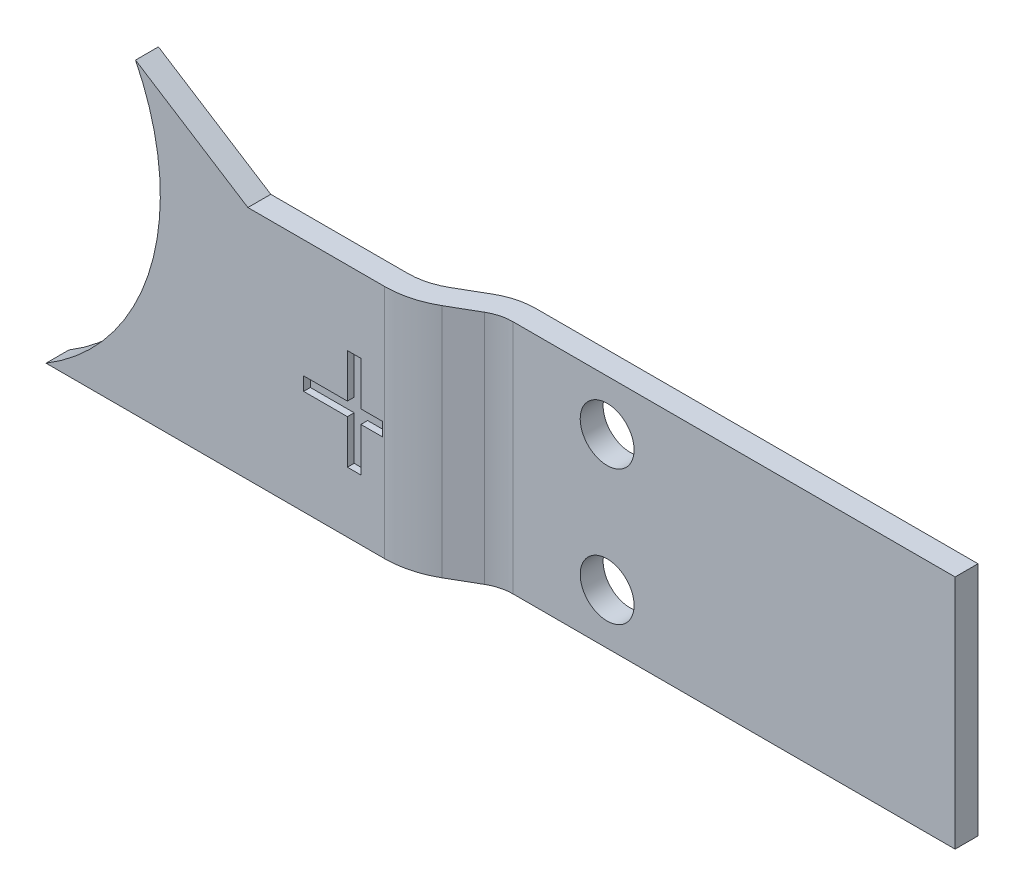
ISO-10303-21;
HEADER;
FILE_DESCRIPTION(('STEP AP214'),'2;1');
FILE_NAME('part.step','',(''),(''),'','','');
FILE_SCHEMA(('AUTOMOTIVE_DESIGN { 1 0 10303 214 1 1 1 1 }'));
ENDSEC;
DATA;
#1=APPLICATION_CONTEXT('core data for automotive mechanical design processes');
#2=APPLICATION_PROTOCOL_DEFINITION('international standard','automotive_design',2000,#1);
#3=PRODUCT_CONTEXT('',#1,'mechanical');
#4=PRODUCT('Part','Part','',(#3));
#5=PRODUCT_RELATED_PRODUCT_CATEGORY('part','',(#4));
#6=PRODUCT_DEFINITION_FORMATION('','',#4);
#7=PRODUCT_DEFINITION_CONTEXT('part definition',#1,'design');
#8=PRODUCT_DEFINITION('design','',#6,#7);
#9=PRODUCT_DEFINITION_SHAPE('','',#8);
#10=(LENGTH_UNIT() NAMED_UNIT(*) SI_UNIT(.MILLI.,.METRE.));
#11=(NAMED_UNIT(*) PLANE_ANGLE_UNIT() SI_UNIT($,.RADIAN.));
#12=(NAMED_UNIT(*) SI_UNIT($,.STERADIAN.) SOLID_ANGLE_UNIT());
#13=UNCERTAINTY_MEASURE_WITH_UNIT(LENGTH_MEASURE(1.E-05),#10,'distance_accuracy_value','');
#14=(GEOMETRIC_REPRESENTATION_CONTEXT(3) GLOBAL_UNCERTAINTY_ASSIGNED_CONTEXT((#13)) GLOBAL_UNIT_ASSIGNED_CONTEXT((#10,
#11,#12)) REPRESENTATION_CONTEXT('',''));
#15=CARTESIAN_POINT('',(0.,0.,0.));
#16=DIRECTION('',(0.,0.,1.));
#17=DIRECTION('',(1.,0.,0.));
#18=AXIS2_PLACEMENT_3D('',#15,#16,#17);
#19=CARTESIAN_POINT('',(0.,0.,3.4));
#20=DIRECTION('',(0.,0.,1.));
#21=DIRECTION('',(1.,0.,0.));
#22=AXIS2_PLACEMENT_3D('',#19,#20,#21);
#23=PLANE('',#22);
#24=DIRECTION('',(0.,1.,0.));
#25=VECTOR('',#24,1.);
#26=CARTESIAN_POINT('',(68.3205080756887,-110.439791148411,3.4));
#27=LINE('',#26,#25);
#28=CARTESIAN_POINT('',(68.3205080756887,-30.,3.4));
#29=VERTEX_POINT('',#28);
#30=CARTESIAN_POINT('',(68.3205080756887,5.,3.4));
#31=VERTEX_POINT('',#30);
#32=EDGE_CURVE('E220',#29,#31,#27,.T.);
#33=ORIENTED_EDGE('',*,*,#32,.T.);
#34=DIRECTION('',(-1.,0.,0.));
#35=VECTOR('',#34,1.);
#36=CARTESIAN_POINT('',(80.,5.,3.4));
#37=LINE('',#36,#35);
#38=CARTESIAN_POINT('',(48.,5.,3.4));
#39=VERTEX_POINT('',#38);
#40=EDGE_CURVE('E206',#31,#39,#37,.T.);
#41=ORIENTED_EDGE('',*,*,#40,.T.);
#42=DIRECTION('',(-0.843495742575284,0.537135860148408,0.));
#43=VECTOR('',#42,1.);
#44=CARTESIAN_POINT('',(48.,5.,3.4));
#45=LINE('',#44,#43);
#46=CARTESIAN_POINT('',(31.3204115569061,15.6215178489808,3.4));
#47=VERTEX_POINT('',#46);
#48=EDGE_CURVE('E216',#39,#47,#45,.T.);
#49=ORIENTED_EDGE('',*,*,#48,.T.);
#50=CARTESIAN_POINT('',(0.,0.,3.4));
#51=DIRECTION('',(0.,0.,1.));
#52=DIRECTION('',(1.,0.,0.));
#53=AXIS2_PLACEMENT_3D('',#50,#51,#52);
#54=CIRCLE('',#53,35.);
#55=CARTESIAN_POINT('',(18.02775637732,-30.,3.4));
#56=VERTEX_POINT('',#55);
#57=EDGE_CURVE('E61',#56,#47,#54,.T.);
#58=ORIENTED_EDGE('',*,*,#57,.F.);
#59=DIRECTION('',(1.,0.,0.));
#60=VECTOR('',#59,1.);
#61=CARTESIAN_POINT('',(0.,-30.,3.4));
#62=LINE('',#61,#60);
#63=EDGE_CURVE('E217',#56,#29,#62,.T.);
#64=ORIENTED_EDGE('',*,*,#63,.T.);
#65=EDGE_LOOP('',(#33,#41,#49,#58,#64));
#66=FACE_BOUND('',#65,.T.);
#67=DIRECTION('',(-1.,0.,0.));
#68=VECTOR('',#67,1.);
#69=CARTESIAN_POINT('',(0.,-12.5,3.4));
#70=LINE('',#69,#68);
#71=CARTESIAN_POINT('',(68.,-12.5,3.4));
#72=VERTEX_POINT('',#71);
#73=CARTESIAN_POINT('',(64.7753826404039,-12.5,3.4));
#74=VERTEX_POINT('',#73);
#75=EDGE_CURVE('E323',#72,#74,#70,.T.);
#76=ORIENTED_EDGE('',*,*,#75,.F.);
#77=DIRECTION('',(0.,1.,0.));
#78=VECTOR('',#77,1.);
#79=CARTESIAN_POINT('',(68.,-110.439791148411,3.4));
#80=LINE('',#79,#78);
#81=CARTESIAN_POINT('',(68.,-14.5,3.4));
#82=VERTEX_POINT('',#81);
#83=EDGE_CURVE('E226',#82,#72,#80,.T.);
#84=ORIENTED_EDGE('',*,*,#83,.F.);
#85=DIRECTION('',(-1.,0.,0.));
#86=VECTOR('',#85,1.);
#87=CARTESIAN_POINT('',(0.,-14.5,3.4));
#88=LINE('',#87,#86);
#89=CARTESIAN_POINT('',(64.7753826404039,-14.5,3.4));
#90=VERTEX_POINT('',#89);
#91=EDGE_CURVE('E53',#82,#90,#88,.T.);
#92=ORIENTED_EDGE('',*,*,#91,.T.);
#93=DIRECTION('',(0.,-1.,0.));
#94=VECTOR('',#93,1.);
#95=CARTESIAN_POINT('',(64.7753826404039,0.,3.4));
#96=LINE('',#95,#94);
#97=CARTESIAN_POINT('',(64.7753826404039,-21.,3.4));
#98=VERTEX_POINT('',#97);
#99=EDGE_CURVE('E289',#90,#98,#96,.T.);
#100=ORIENTED_EDGE('',*,*,#99,.T.);
#101=DIRECTION('',(-1.,0.,0.));
#102=VECTOR('',#101,1.);
#103=CARTESIAN_POINT('',(0.,-21.,3.4));
#104=LINE('',#103,#102);
#105=CARTESIAN_POINT('',(62.7753826404039,-21.,3.4));
#106=VERTEX_POINT('',#105);
#107=EDGE_CURVE('E294',#98,#106,#104,.T.);
#108=ORIENTED_EDGE('',*,*,#107,.T.);
#109=DIRECTION('',(0.,-1.,0.));
#110=VECTOR('',#109,1.);
#111=CARTESIAN_POINT('',(62.7753826404039,0.,3.4));
#112=LINE('',#111,#110);
#113=CARTESIAN_POINT('',(62.7753826404039,-14.5,3.4));
#114=VERTEX_POINT('',#113);
#115=EDGE_CURVE('E343',#114,#106,#112,.T.);
#116=ORIENTED_EDGE('',*,*,#115,.F.);
#117=DIRECTION('',(-1.,0.,0.));
#118=VECTOR('',#117,1.);
#119=CARTESIAN_POINT('',(0.,-14.5,3.4));
#120=LINE('',#119,#118);
#121=CARTESIAN_POINT('',(56.2753826404039,-14.5,3.4));
#122=VERTEX_POINT('',#121);
#123=EDGE_CURVE('E340',#114,#122,#120,.T.);
#124=ORIENTED_EDGE('',*,*,#123,.T.);
#125=DIRECTION('',(0.,-1.,0.));
#126=VECTOR('',#125,1.);
#127=CARTESIAN_POINT('',(56.2753826404039,0.,3.4));
#128=LINE('',#127,#126);
#129=CARTESIAN_POINT('',(56.2753826404039,-12.5,3.4));
#130=VERTEX_POINT('',#129);
#131=EDGE_CURVE('E337',#130,#122,#128,.T.);
#132=ORIENTED_EDGE('',*,*,#131,.F.);
#133=DIRECTION('',(-1.,0.,0.));
#134=VECTOR('',#133,1.);
#135=CARTESIAN_POINT('',(0.,-12.5,3.4));
#136=LINE('',#135,#134);
#137=CARTESIAN_POINT('',(62.7753826404039,-12.5,3.4));
#138=VERTEX_POINT('',#137);
#139=EDGE_CURVE('E334',#138,#130,#136,.T.);
#140=ORIENTED_EDGE('',*,*,#139,.F.);
#141=DIRECTION('',(0.,-1.,0.));
#142=VECTOR('',#141,1.);
#143=CARTESIAN_POINT('',(62.7753826404039,0.,3.4));
#144=LINE('',#143,#142);
#145=CARTESIAN_POINT('',(62.7753826404039,-6.00000000000001,3.4));
#146=VERTEX_POINT('',#145);
#147=EDGE_CURVE('E331',#146,#138,#144,.T.);
#148=ORIENTED_EDGE('',*,*,#147,.F.);
#149=DIRECTION('',(-1.,0.,0.));
#150=VECTOR('',#149,1.);
#151=CARTESIAN_POINT('',(0.,-6.00000000000001,3.4));
#152=LINE('',#151,#150);
#153=CARTESIAN_POINT('',(64.7753826404039,-6.00000000000001,3.4));
#154=VERTEX_POINT('',#153);
#155=EDGE_CURVE('E328',#154,#146,#152,.T.);
#156=ORIENTED_EDGE('',*,*,#155,.F.);
#157=DIRECTION('',(0.,-1.,0.));
#158=VECTOR('',#157,1.);
#159=CARTESIAN_POINT('',(64.7753826404039,0.,3.4));
#160=LINE('',#159,#158);
#161=EDGE_CURVE('E325',#154,#74,#160,.T.);
#162=ORIENTED_EDGE('',*,*,#161,.T.);
#163=EDGE_LOOP('',(#76,#84,#92,#100,#108,#116,#124,#132,#140,#148,#156,#162));
#164=FACE_BOUND('',#163,.T.);
#165=ADVANCED_FACE('F36',(#66,#164),#23,.T.);
#166=CARTESIAN_POINT('',(0.,0.,0.));
#167=DIRECTION('',(0.,0.,1.));
#168=DIRECTION('',(1.,0.,0.));
#169=AXIS2_PLACEMENT_3D('',#166,#167,#168);
#170=PLANE('',#169);
#171=DIRECTION('',(-1.,0.,0.));
#172=VECTOR('',#171,1.);
#173=CARTESIAN_POINT('',(80.,5.,0.));
#174=LINE('',#173,#172);
#175=CARTESIAN_POINT('',(68.3205080756887,5.,0.));
#176=VERTEX_POINT('',#175);
#177=CARTESIAN_POINT('',(48.,5.,0.));
#178=VERTEX_POINT('',#177);
#179=EDGE_CURVE('E381',#176,#178,#174,.T.);
#180=ORIENTED_EDGE('',*,*,#179,.F.);
#181=DIRECTION('',(0.,1.,0.));
#182=VECTOR('',#181,1.);
#183=CARTESIAN_POINT('',(68.3205080756887,-110.439791148411,0.));
#184=LINE('',#183,#182);
#185=CARTESIAN_POINT('',(68.3205080756887,-30.,0.));
#186=VERTEX_POINT('',#185);
#187=EDGE_CURVE('E261',#186,#176,#184,.T.);
#188=ORIENTED_EDGE('',*,*,#187,.F.);
#189=DIRECTION('',(1.,0.,0.));
#190=VECTOR('',#189,1.);
#191=CARTESIAN_POINT('',(0.,-30.,0.));
#192=LINE('',#191,#190);
#193=CARTESIAN_POINT('',(18.02775637732,-30.,0.));
#194=VERTEX_POINT('',#193);
#195=EDGE_CURVE('E376',#194,#186,#192,.T.);
#196=ORIENTED_EDGE('',*,*,#195,.F.);
#197=CARTESIAN_POINT('',(0.,0.,0.));
#198=DIRECTION('',(0.,0.,-1.));
#199=DIRECTION('',(-1.,0.,0.));
#200=AXIS2_PLACEMENT_3D('',#197,#198,#199);
#201=CIRCLE('',#200,35.);
#202=CARTESIAN_POINT('',(31.3204115569061,15.6215178489808,0.));
#203=VERTEX_POINT('',#202);
#204=EDGE_CURVE('E351',#203,#194,#201,.T.);
#205=ORIENTED_EDGE('',*,*,#204,.F.);
#206=DIRECTION('',(-0.843495742575284,0.537135860148408,0.));
#207=VECTOR('',#206,1.);
#208=CARTESIAN_POINT('',(48.,5.,0.));
#209=LINE('',#208,#207);
#210=EDGE_CURVE('E377',#178,#203,#209,.T.);
#211=ORIENTED_EDGE('',*,*,#210,.F.);
#212=EDGE_LOOP('',(#180,#188,#196,#205,#211));
#213=FACE_BOUND('',#212,.T.);
#214=ADVANCED_FACE('F461',(#213),#170,.F.);
#215=CARTESIAN_POINT('',(0.,-30.,3.4));
#216=DIRECTION('',(0.,1.,0.));
#217=DIRECTION('',(-1.,0.,0.));
#218=AXIS2_PLACEMENT_3D('',#215,#216,#217);
#219=PLANE('',#218);
#220=ORIENTED_EDGE('',*,*,#195,.T.);
#221=CARTESIAN_POINT('',(68.3205080756888,-30.,-10.));
#222=DIRECTION('',(0.,1.,0.));
#223=DIRECTION('',(-1.,0.,0.));
#224=AXIS2_PLACEMENT_3D('',#221,#222,#223);
#225=CIRCLE('',#224,10.);
#226=CARTESIAN_POINT('',(73.3205080756888,-30.,-1.33974596215563));
#227=VERTEX_POINT('',#226);
#228=EDGE_CURVE('E238',#186,#227,#225,.T.);
#229=ORIENTED_EDGE('',*,*,#228,.T.);
#230=DIRECTION('',(0.866025403784437,0.,-0.500000000000002));
#231=VECTOR('',#230,1.);
#232=CARTESIAN_POINT('',(73.3205080756888,-30.,-1.33974596215564));
#233=LINE('',#232,#231);
#234=CARTESIAN_POINT('',(77.3397459621556,-30.,-3.66025403784437));
#235=VERTEX_POINT('',#234);
#236=EDGE_CURVE('E409',#227,#235,#233,.T.);
#237=ORIENTED_EDGE('',*,*,#236,.T.);
#238=CARTESIAN_POINT('',(82.3397459621556,-30.,5.));
#239=DIRECTION('',(0.,1.,0.));
#240=DIRECTION('',(-1.,0.,0.));
#241=AXIS2_PLACEMENT_3D('',#238,#239,#240);
#242=CIRCLE('',#241,10.);
#243=CARTESIAN_POINT('',(82.3397459621556,-30.,-5.));
#244=VERTEX_POINT('',#243);
#245=EDGE_CURVE('E408',#235,#244,#242,.F.);
#246=ORIENTED_EDGE('',*,*,#245,.T.);
#247=DIRECTION('',(1.,0.,0.));
#248=VECTOR('',#247,1.);
#249=CARTESIAN_POINT('',(82.3397459621556,-30.,-5.));
#250=LINE('',#249,#248);
#251=CARTESIAN_POINT('',(148.,-30.,-5.));
#252=VERTEX_POINT('',#251);
#253=EDGE_CURVE('E406',#244,#252,#250,.T.);
#254=ORIENTED_EDGE('',*,*,#253,.T.);
#255=DIRECTION('',(0.,0.,1.));
#256=VECTOR('',#255,1.);
#257=CARTESIAN_POINT('',(148.,-30.,-1.6));
#258=LINE('',#257,#256);
#259=CARTESIAN_POINT('',(148.,-30.,-1.6));
#260=VERTEX_POINT('',#259);
#261=EDGE_CURVE('E404',#252,#260,#258,.T.);
#262=ORIENTED_EDGE('',*,*,#261,.T.);
#263=DIRECTION('',(-1.,0.,0.));
#264=VECTOR('',#263,1.);
#265=CARTESIAN_POINT('',(83.,-30.,-1.6));
#266=LINE('',#265,#264);
#267=CARTESIAN_POINT('',(82.3397459621556,-30.,-1.59999999999999));
#268=VERTEX_POINT('',#267);
#269=EDGE_CURVE('E402',#260,#268,#266,.T.);
#270=ORIENTED_EDGE('',*,*,#269,.T.);
#271=CARTESIAN_POINT('',(82.3397459621556,-30.,5.));
#272=DIRECTION('',(0.,1.,0.));
#273=DIRECTION('',(-1.,0.,0.));
#274=AXIS2_PLACEMENT_3D('',#271,#272,#273);
#275=CIRCLE('',#274,6.59999999999999);
#276=CARTESIAN_POINT('',(79.0397459621556,-30.,-0.715767664977264));
#277=VERTEX_POINT('',#276);
#278=EDGE_CURVE('E400',#268,#277,#275,.T.);
#279=ORIENTED_EDGE('',*,*,#278,.T.);
#280=DIRECTION('',(-0.866025403784439,0.,0.5));
#281=VECTOR('',#280,1.);
#282=CARTESIAN_POINT('',(75.0205080756889,-30.,1.60474041071144));
#283=LINE('',#282,#281);
#284=CARTESIAN_POINT('',(75.0205080756889,-30.,1.60474041071143));
#285=VERTEX_POINT('',#284);
#286=EDGE_CURVE('E398',#277,#285,#283,.T.);
#287=ORIENTED_EDGE('',*,*,#286,.T.);
#288=CARTESIAN_POINT('',(68.3205080756888,-30.,-10.));
#289=DIRECTION('',(0.,1.,0.));
#290=DIRECTION('',(-1.,0.,0.));
#291=AXIS2_PLACEMENT_3D('',#288,#289,#290);
#292=CIRCLE('',#291,13.4);
#293=EDGE_CURVE('E264',#285,#29,#292,.F.);
#294=ORIENTED_EDGE('',*,*,#293,.T.);
#295=ORIENTED_EDGE('',*,*,#63,.F.);
#296=DIRECTION('',(0.,0.,-1.));
#297=VECTOR('',#296,1.);
#298=CARTESIAN_POINT('',(18.02775637732,-30.,10.));
#299=LINE('',#298,#297);
#300=EDGE_CURVE('E373',#56,#194,#299,.T.);
#301=ORIENTED_EDGE('',*,*,#300,.T.);
#302=EDGE_LOOP('',(#220,#229,#237,#246,#254,#262,#270,#279,#287,#294,#295,#301));
#303=FACE_BOUND('',#302,.T.);
#304=ADVANCED_FACE('F38',(#303),#219,.F.);
#305=CARTESIAN_POINT('',(80.,5.,3.4));
#306=DIRECTION('',(0.,-1.,0.));
#307=DIRECTION('',(1.,0.,0.));
#308=AXIS2_PLACEMENT_3D('',#305,#306,#307);
#309=PLANE('',#308);
#310=ORIENTED_EDGE('',*,*,#40,.F.);
#311=CARTESIAN_POINT('',(68.3205080756888,5.,-10.));
#312=DIRECTION('',(0.,1.,0.));
#313=DIRECTION('',(-1.,0.,0.));
#314=AXIS2_PLACEMENT_3D('',#311,#312,#313);
#315=CIRCLE('',#314,13.4);
#316=CARTESIAN_POINT('',(75.0205080756888,5.,1.60474041071144));
#317=VERTEX_POINT('',#316);
#318=EDGE_CURVE('E211',#31,#317,#315,.T.);
#319=ORIENTED_EDGE('',*,*,#318,.T.);
#320=DIRECTION('',(0.866025403784439,0.,-0.5));
#321=VECTOR('',#320,1.);
#322=CARTESIAN_POINT('',(75.0205080756888,5.,1.60474041071144));
#323=LINE('',#322,#321);
#324=CARTESIAN_POINT('',(79.0397459621556,5.,-0.715767664977262));
#325=VERTEX_POINT('',#324);
#326=EDGE_CURVE('E231',#317,#325,#323,.T.);
#327=ORIENTED_EDGE('',*,*,#326,.T.);
#328=CARTESIAN_POINT('',(82.3397459621556,5.,5.));
#329=DIRECTION('',(0.,-1.,0.));
#330=DIRECTION('',(1.,0.,0.));
#331=AXIS2_PLACEMENT_3D('',#328,#329,#330);
#332=CIRCLE('',#331,6.59999999999999);
#333=CARTESIAN_POINT('',(82.3397459621556,5.,-1.6));
#334=VERTEX_POINT('',#333);
#335=EDGE_CURVE('E233',#325,#334,#332,.T.);
#336=ORIENTED_EDGE('',*,*,#335,.T.);
#337=DIRECTION('',(1.,0.,0.));
#338=VECTOR('',#337,1.);
#339=CARTESIAN_POINT('',(83.,5.,-1.6));
#340=LINE('',#339,#338);
#341=CARTESIAN_POINT('',(148.,5.00000000000001,-1.6));
#342=VERTEX_POINT('',#341);
#343=EDGE_CURVE('E243',#334,#342,#340,.T.);
#344=ORIENTED_EDGE('',*,*,#343,.T.);
#345=DIRECTION('',(0.,0.,-1.));
#346=VECTOR('',#345,1.);
#347=CARTESIAN_POINT('',(148.,5.00000000000001,-1.6));
#348=LINE('',#347,#346);
#349=CARTESIAN_POINT('',(148.,5.00000000000001,-5.));
#350=VERTEX_POINT('',#349);
#351=EDGE_CURVE('E246',#342,#350,#348,.T.);
#352=ORIENTED_EDGE('',*,*,#351,.T.);
#353=DIRECTION('',(-1.,0.,0.));
#354=VECTOR('',#353,1.);
#355=CARTESIAN_POINT('',(82.3397459621556,5.,-5.));
#356=LINE('',#355,#354);
#357=CARTESIAN_POINT('',(82.3397459621556,5.,-5.));
#358=VERTEX_POINT('',#357);
#359=EDGE_CURVE('E249',#350,#358,#356,.T.);
#360=ORIENTED_EDGE('',*,*,#359,.T.);
#361=CARTESIAN_POINT('',(82.3397459621556,5.,5.));
#362=DIRECTION('',(0.,1.,0.));
#363=DIRECTION('',(1.,0.,0.));
#364=AXIS2_PLACEMENT_3D('',#361,#362,#363);
#365=CIRCLE('',#364,10.);
#366=CARTESIAN_POINT('',(77.3397459621555,5.,-3.66025403784436));
#367=VERTEX_POINT('',#366);
#368=EDGE_CURVE('E252',#358,#367,#365,.T.);
#369=ORIENTED_EDGE('',*,*,#368,.T.);
#370=DIRECTION('',(-0.866025403784437,0.,0.500000000000002));
#371=VECTOR('',#370,1.);
#372=CARTESIAN_POINT('',(73.3205080756888,5.,-1.33974596215564));
#373=LINE('',#372,#371);
#374=CARTESIAN_POINT('',(73.3205080756888,5.,-1.33974596215564));
#375=VERTEX_POINT('',#374);
#376=EDGE_CURVE('E255',#367,#375,#373,.T.);
#377=ORIENTED_EDGE('',*,*,#376,.T.);
#378=CARTESIAN_POINT('',(68.3205080756888,5.,-10.));
#379=DIRECTION('',(0.,-1.,0.));
#380=DIRECTION('',(-1.,0.,0.));
#381=AXIS2_PLACEMENT_3D('',#378,#379,#380);
#382=CIRCLE('',#381,10.);
#383=EDGE_CURVE('E258',#375,#176,#382,.T.);
#384=ORIENTED_EDGE('',*,*,#383,.T.);
#385=ORIENTED_EDGE('',*,*,#179,.T.);
#386=DIRECTION('',(0.,0.,-1.));
#387=VECTOR('',#386,1.);
#388=CARTESIAN_POINT('',(48.,5.,3.4));
#389=LINE('',#388,#387);
#390=EDGE_CURVE('E45',#39,#178,#389,.T.);
#391=ORIENTED_EDGE('',*,*,#390,.F.);
#392=EDGE_LOOP('',(#310,#319,#327,#336,#344,#352,#360,#369,#377,#384,#385,#391));
#393=FACE_BOUND('',#392,.T.);
#394=ADVANCED_FACE('F208',(#393),#309,.F.);
#395=CARTESIAN_POINT('',(48.,5.,3.4));
#396=DIRECTION('',(-0.537135860148408,-0.843495742575284,0.));
#397=DIRECTION('',(0.843495742575284,-0.537135860148408,0.));
#398=AXIS2_PLACEMENT_3D('',#395,#396,#397);
#399=PLANE('',#398);
#400=ORIENTED_EDGE('',*,*,#210,.T.);
#401=DIRECTION('',(0.,0.,-1.));
#402=VECTOR('',#401,1.);
#403=CARTESIAN_POINT('',(31.3204115569061,15.6215178489808,10.));
#404=LINE('',#403,#402);
#405=EDGE_CURVE('E11',#203,#47,#404,.F.);
#406=ORIENTED_EDGE('',*,*,#405,.T.);
#407=ORIENTED_EDGE('',*,*,#48,.F.);
#408=ORIENTED_EDGE('',*,*,#390,.T.);
#409=EDGE_LOOP('',(#400,#406,#407,#408));
#410=FACE_BOUND('',#409,.T.);
#411=ADVANCED_FACE('F472',(#410),#399,.F.);
#412=CARTESIAN_POINT('',(0.,0.,10.));
#413=DIRECTION('',(0.,0.,-1.));
#414=DIRECTION('',(-1.,0.,0.));
#415=AXIS2_PLACEMENT_3D('',#412,#413,#414);
#416=CYLINDRICAL_SURFACE('',#415,35.);
#417=ORIENTED_EDGE('',*,*,#57,.T.);
#418=ORIENTED_EDGE('',*,*,#405,.F.);
#419=ORIENTED_EDGE('',*,*,#204,.T.);
#420=ORIENTED_EDGE('',*,*,#300,.F.);
#421=EDGE_LOOP('',(#417,#418,#419,#420));
#422=FACE_BOUND('',#421,.T.);
#423=ADVANCED_FACE('F469',(#422),#416,.F.);
#424=CARTESIAN_POINT('',(64.7753826404039,0.,2.4));
#425=DIRECTION('',(-1.,0.,0.));
#426=DIRECTION('',(0.,0.,1.));
#427=AXIS2_PLACEMENT_3D('',#424,#425,#426);
#428=PLANE('',#427);
#429=ORIENTED_EDGE('',*,*,#99,.F.);
#430=DIRECTION('',(0.,0.,1.));
#431=VECTOR('',#430,1.);
#432=CARTESIAN_POINT('',(64.7753826404039,-14.5,2.4));
#433=LINE('',#432,#431);
#434=CARTESIAN_POINT('',(64.7753826404039,-14.5,2.4));
#435=VERTEX_POINT('',#434);
#436=EDGE_CURVE('E320',#435,#90,#433,.T.);
#437=ORIENTED_EDGE('',*,*,#436,.F.);
#438=DIRECTION('',(0.,-1.,0.));
#439=VECTOR('',#438,1.);
#440=CARTESIAN_POINT('',(64.7753826404039,0.,2.4));
#441=LINE('',#440,#439);
#442=CARTESIAN_POINT('',(64.7753826404039,-21.,2.4));
#443=VERTEX_POINT('',#442);
#444=EDGE_CURVE('E290',#435,#443,#441,.T.);
#445=ORIENTED_EDGE('',*,*,#444,.T.);
#446=DIRECTION('',(0.,0.,1.));
#447=VECTOR('',#446,1.);
#448=CARTESIAN_POINT('',(64.7753826404039,-21.,2.4));
#449=LINE('',#448,#447);
#450=EDGE_CURVE('E348',#443,#98,#449,.T.);
#451=ORIENTED_EDGE('',*,*,#450,.T.);
#452=EDGE_LOOP('',(#429,#437,#445,#451));
#453=FACE_BOUND('',#452,.T.);
#454=ADVANCED_FACE('F575',(#453),#428,.T.);
#455=CARTESIAN_POINT('',(0.,-21.,2.4));
#456=DIRECTION('',(0.,1.,0.));
#457=DIRECTION('',(0.,0.,1.));
#458=AXIS2_PLACEMENT_3D('',#455,#456,#457);
#459=PLANE('',#458);
#460=ORIENTED_EDGE('',*,*,#107,.F.);
#461=ORIENTED_EDGE('',*,*,#450,.F.);
#462=DIRECTION('',(-1.,0.,0.));
#463=VECTOR('',#462,1.);
#464=CARTESIAN_POINT('',(0.,-21.,2.4));
#465=LINE('',#464,#463);
#466=CARTESIAN_POINT('',(62.7753826404039,-21.,2.4));
#467=VERTEX_POINT('',#466);
#468=EDGE_CURVE('E318',#443,#467,#465,.T.);
#469=ORIENTED_EDGE('',*,*,#468,.T.);
#470=DIRECTION('',(0.,0.,1.));
#471=VECTOR('',#470,1.);
#472=CARTESIAN_POINT('',(62.7753826404039,-21.,2.4));
#473=LINE('',#472,#471);
#474=EDGE_CURVE('E352',#467,#106,#473,.T.);
#475=ORIENTED_EDGE('',*,*,#474,.T.);
#476=EDGE_LOOP('',(#460,#461,#469,#475));
#477=FACE_BOUND('',#476,.T.);
#478=ADVANCED_FACE('F565',(#477),#459,.T.);
#479=CARTESIAN_POINT('',(62.7753826404039,0.,2.4));
#480=DIRECTION('',(-1.,0.,0.));
#481=DIRECTION('',(0.,0.,1.));
#482=AXIS2_PLACEMENT_3D('',#479,#480,#481);
#483=PLANE('',#482);
#484=ORIENTED_EDGE('',*,*,#115,.T.);
#485=ORIENTED_EDGE('',*,*,#474,.F.);
#486=DIRECTION('',(0.,-1.,0.));
#487=VECTOR('',#486,1.);
#488=CARTESIAN_POINT('',(62.7753826404039,0.,2.4));
#489=LINE('',#488,#487);
#490=CARTESIAN_POINT('',(62.7753826404039,-14.5,2.4));
#491=VERTEX_POINT('',#490);
#492=EDGE_CURVE('E315',#491,#467,#489,.T.);
#493=ORIENTED_EDGE('',*,*,#492,.F.);
#494=DIRECTION('',(0.,0.,1.));
#495=VECTOR('',#494,1.);
#496=CARTESIAN_POINT('',(62.7753826404039,-14.5,2.4));
#497=LINE('',#496,#495);
#498=EDGE_CURVE('E354',#491,#114,#497,.T.);
#499=ORIENTED_EDGE('',*,*,#498,.T.);
#500=EDGE_LOOP('',(#484,#485,#493,#499));
#501=FACE_BOUND('',#500,.T.);
#502=ADVANCED_FACE('F555',(#501),#483,.F.);
#503=CARTESIAN_POINT('',(0.,-14.5,2.4));
#504=DIRECTION('',(0.,1.,0.));
#505=DIRECTION('',(-1.,0.,0.));
#506=AXIS2_PLACEMENT_3D('',#503,#504,#505);
#507=PLANE('',#506);
#508=ORIENTED_EDGE('',*,*,#123,.F.);
#509=ORIENTED_EDGE('',*,*,#498,.F.);
#510=DIRECTION('',(-1.,0.,0.));
#511=VECTOR('',#510,1.);
#512=CARTESIAN_POINT('',(0.,-14.5,2.4));
#513=LINE('',#512,#511);
#514=CARTESIAN_POINT('',(56.2753826404039,-14.5,2.4));
#515=VERTEX_POINT('',#514);
#516=EDGE_CURVE('E313',#491,#515,#513,.T.);
#517=ORIENTED_EDGE('',*,*,#516,.T.);
#518=DIRECTION('',(0.,0.,1.));
#519=VECTOR('',#518,1.);
#520=CARTESIAN_POINT('',(56.2753826404039,-14.5,2.4));
#521=LINE('',#520,#519);
#522=EDGE_CURVE('E356',#515,#122,#521,.T.);
#523=ORIENTED_EDGE('',*,*,#522,.T.);
#524=EDGE_LOOP('',(#508,#509,#517,#523));
#525=FACE_BOUND('',#524,.T.);
#526=ADVANCED_FACE('F545',(#525),#507,.T.);
#527=CARTESIAN_POINT('',(56.2753826404039,0.,2.4));
#528=DIRECTION('',(-1.,0.,0.));
#529=DIRECTION('',(0.,0.,1.));
#530=AXIS2_PLACEMENT_3D('',#527,#528,#529);
#531=PLANE('',#530);
#532=ORIENTED_EDGE('',*,*,#131,.T.);
#533=ORIENTED_EDGE('',*,*,#522,.F.);
#534=DIRECTION('',(0.,-1.,0.));
#535=VECTOR('',#534,1.);
#536=CARTESIAN_POINT('',(56.2753826404039,0.,2.4));
#537=LINE('',#536,#535);
#538=CARTESIAN_POINT('',(56.2753826404039,-12.5,2.4));
#539=VERTEX_POINT('',#538);
#540=EDGE_CURVE('E310',#539,#515,#537,.T.);
#541=ORIENTED_EDGE('',*,*,#540,.F.);
#542=DIRECTION('',(0.,0.,1.));
#543=VECTOR('',#542,1.);
#544=CARTESIAN_POINT('',(56.2753826404039,-12.5,2.4));
#545=LINE('',#544,#543);
#546=EDGE_CURVE('E358',#539,#130,#545,.T.);
#547=ORIENTED_EDGE('',*,*,#546,.T.);
#548=EDGE_LOOP('',(#532,#533,#541,#547));
#549=FACE_BOUND('',#548,.T.);
#550=ADVANCED_FACE('F535',(#549),#531,.F.);
#551=CARTESIAN_POINT('',(0.,-12.5,2.4));
#552=DIRECTION('',(0.,1.,0.));
#553=DIRECTION('',(0.,0.,1.));
#554=AXIS2_PLACEMENT_3D('',#551,#552,#553);
#555=PLANE('',#554);
#556=ORIENTED_EDGE('',*,*,#139,.T.);
#557=ORIENTED_EDGE('',*,*,#546,.F.);
#558=DIRECTION('',(-1.,0.,0.));
#559=VECTOR('',#558,1.);
#560=CARTESIAN_POINT('',(0.,-12.5,2.4));
#561=LINE('',#560,#559);
#562=CARTESIAN_POINT('',(62.7753826404039,-12.5,2.4));
#563=VERTEX_POINT('',#562);
#564=EDGE_CURVE('E307',#563,#539,#561,.T.);
#565=ORIENTED_EDGE('',*,*,#564,.F.);
#566=DIRECTION('',(0.,0.,1.));
#567=VECTOR('',#566,1.);
#568=CARTESIAN_POINT('',(62.7753826404039,-12.5,2.4));
#569=LINE('',#568,#567);
#570=EDGE_CURVE('E360',#563,#138,#569,.T.);
#571=ORIENTED_EDGE('',*,*,#570,.T.);
#572=EDGE_LOOP('',(#556,#557,#565,#571));
#573=FACE_BOUND('',#572,.T.);
#574=ADVANCED_FACE('F525',(#573),#555,.F.);
#575=CARTESIAN_POINT('',(62.7753826404039,0.,2.4));
#576=DIRECTION('',(-1.,0.,0.));
#577=DIRECTION('',(0.,0.,1.));
#578=AXIS2_PLACEMENT_3D('',#575,#576,#577);
#579=PLANE('',#578);
#580=ORIENTED_EDGE('',*,*,#147,.T.);
#581=ORIENTED_EDGE('',*,*,#570,.F.);
#582=DIRECTION('',(0.,-1.,0.));
#583=VECTOR('',#582,1.);
#584=CARTESIAN_POINT('',(62.7753826404039,0.,2.4));
#585=LINE('',#584,#583);
#586=CARTESIAN_POINT('',(62.7753826404039,-6.00000000000001,2.4));
#587=VERTEX_POINT('',#586);
#588=EDGE_CURVE('E304',#587,#563,#585,.T.);
#589=ORIENTED_EDGE('',*,*,#588,.F.);
#590=DIRECTION('',(0.,0.,1.));
#591=VECTOR('',#590,1.);
#592=CARTESIAN_POINT('',(62.7753826404039,-6.00000000000001,2.4));
#593=LINE('',#592,#591);
#594=EDGE_CURVE('E362',#587,#146,#593,.T.);
#595=ORIENTED_EDGE('',*,*,#594,.T.);
#596=EDGE_LOOP('',(#580,#581,#589,#595));
#597=FACE_BOUND('',#596,.T.);
#598=ADVANCED_FACE('F515',(#597),#579,.F.);
#599=CARTESIAN_POINT('',(0.,-6.00000000000001,2.4));
#600=DIRECTION('',(0.,1.,0.));
#601=DIRECTION('',(0.,0.,1.));
#602=AXIS2_PLACEMENT_3D('',#599,#600,#601);
#603=PLANE('',#602);
#604=ORIENTED_EDGE('',*,*,#155,.T.);
#605=ORIENTED_EDGE('',*,*,#594,.F.);
#606=DIRECTION('',(-1.,0.,0.));
#607=VECTOR('',#606,1.);
#608=CARTESIAN_POINT('',(0.,-6.00000000000001,2.4));
#609=LINE('',#608,#607);
#610=CARTESIAN_POINT('',(64.7753826404039,-6.00000000000001,2.4));
#611=VERTEX_POINT('',#610);
#612=EDGE_CURVE('E301',#611,#587,#609,.T.);
#613=ORIENTED_EDGE('',*,*,#612,.F.);
#614=DIRECTION('',(0.,0.,1.));
#615=VECTOR('',#614,1.);
#616=CARTESIAN_POINT('',(64.7753826404039,-6.00000000000001,2.4));
#617=LINE('',#616,#615);
#618=EDGE_CURVE('E364',#611,#154,#617,.T.);
#619=ORIENTED_EDGE('',*,*,#618,.T.);
#620=EDGE_LOOP('',(#604,#605,#613,#619));
#621=FACE_BOUND('',#620,.T.);
#622=ADVANCED_FACE('F503',(#621),#603,.F.);
#623=CARTESIAN_POINT('',(64.7753826404039,0.,2.4));
#624=DIRECTION('',(-1.,0.,0.));
#625=DIRECTION('',(0.,0.,1.));
#626=AXIS2_PLACEMENT_3D('',#623,#624,#625);
#627=PLANE('',#626);
#628=ORIENTED_EDGE('',*,*,#161,.F.);
#629=ORIENTED_EDGE('',*,*,#618,.F.);
#630=DIRECTION('',(0.,-1.,0.));
#631=VECTOR('',#630,1.);
#632=CARTESIAN_POINT('',(64.7753826404039,0.,2.4));
#633=LINE('',#632,#631);
#634=CARTESIAN_POINT('',(64.7753826404039,-12.5,2.4));
#635=VERTEX_POINT('',#634);
#636=EDGE_CURVE('E298',#611,#635,#633,.T.);
#637=ORIENTED_EDGE('',*,*,#636,.T.);
#638=DIRECTION('',(0.,0.,1.));
#639=VECTOR('',#638,1.);
#640=CARTESIAN_POINT('',(64.7753826404039,-12.5,2.4));
#641=LINE('',#640,#639);
#642=EDGE_CURVE('E366',#635,#74,#641,.T.);
#643=ORIENTED_EDGE('',*,*,#642,.T.);
#644=EDGE_LOOP('',(#628,#629,#637,#643));
#645=FACE_BOUND('',#644,.T.);
#646=ADVANCED_FACE('F497',(#645),#627,.T.);
#647=CARTESIAN_POINT('',(0.,-12.5,2.4));
#648=DIRECTION('',(0.,1.,0.));
#649=DIRECTION('',(0.,0.,1.));
#650=AXIS2_PLACEMENT_3D('',#647,#648,#649);
#651=PLANE('',#650);
#652=DIRECTION('',(-1.,0.,0.));
#653=VECTOR('',#652,1.);
#654=CARTESIAN_POINT('',(0.,-12.5,2.4));
#655=LINE('',#654,#653);
#656=CARTESIAN_POINT('',(68.,-12.5,2.4));
#657=VERTEX_POINT('',#656);
#658=EDGE_CURVE('E296',#657,#635,#655,.T.);
#659=ORIENTED_EDGE('',*,*,#658,.F.);
#660=DIRECTION('',(0.,0.,-1.));
#661=VECTOR('',#660,1.);
#662=CARTESIAN_POINT('',(68.,-12.5,3.401));
#663=LINE('',#662,#661);
#664=EDGE_CURVE('E287',#72,#657,#663,.T.);
#665=ORIENTED_EDGE('',*,*,#664,.F.);
#666=ORIENTED_EDGE('',*,*,#75,.T.);
#667=ORIENTED_EDGE('',*,*,#642,.F.);
#668=EDGE_LOOP('',(#659,#665,#666,#667));
#669=FACE_BOUND('',#668,.T.);
#670=ADVANCED_FACE('F502',(#669),#651,.F.);
#671=CARTESIAN_POINT('',(0.,-14.5,2.4));
#672=DIRECTION('',(0.,1.,0.));
#673=DIRECTION('',(0.,0.,1.));
#674=AXIS2_PLACEMENT_3D('',#671,#672,#673);
#675=PLANE('',#674);
#676=DIRECTION('',(0.,0.,-1.));
#677=VECTOR('',#676,1.);
#678=CARTESIAN_POINT('',(68.,-14.5,3.401));
#679=LINE('',#678,#677);
#680=CARTESIAN_POINT('',(68.,-14.5,2.4));
#681=VERTEX_POINT('',#680);
#682=EDGE_CURVE('E284',#82,#681,#679,.T.);
#683=ORIENTED_EDGE('',*,*,#682,.T.);
#684=DIRECTION('',(-1.,0.,0.));
#685=VECTOR('',#684,1.);
#686=CARTESIAN_POINT('',(0.,-14.5,2.4));
#687=LINE('',#686,#685);
#688=EDGE_CURVE('E293',#681,#435,#687,.T.);
#689=ORIENTED_EDGE('',*,*,#688,.T.);
#690=ORIENTED_EDGE('',*,*,#436,.T.);
#691=ORIENTED_EDGE('',*,*,#91,.F.);
#692=EDGE_LOOP('',(#683,#689,#690,#691));
#693=FACE_BOUND('',#692,.T.);
#694=ADVANCED_FACE('F726',(#693),#675,.T.);
#695=CARTESIAN_POINT('',(0.,0.,2.4));
#696=DIRECTION('',(0.,0.,1.));
#697=DIRECTION('',(1.,0.,0.));
#698=AXIS2_PLACEMENT_3D('',#695,#696,#697);
#699=PLANE('',#698);
#700=DIRECTION('',(0.,1.,0.));
#701=VECTOR('',#700,1.);
#702=CARTESIAN_POINT('',(68.,-30.,2.4));
#703=LINE('',#702,#701);
#704=EDGE_CURVE('E281',#681,#657,#703,.T.);
#705=ORIENTED_EDGE('',*,*,#704,.T.);
#706=ORIENTED_EDGE('',*,*,#658,.T.);
#707=ORIENTED_EDGE('',*,*,#636,.F.);
#708=ORIENTED_EDGE('',*,*,#612,.T.);
#709=ORIENTED_EDGE('',*,*,#588,.T.);
#710=ORIENTED_EDGE('',*,*,#564,.T.);
#711=ORIENTED_EDGE('',*,*,#540,.T.);
#712=ORIENTED_EDGE('',*,*,#516,.F.);
#713=ORIENTED_EDGE('',*,*,#492,.T.);
#714=ORIENTED_EDGE('',*,*,#468,.F.);
#715=ORIENTED_EDGE('',*,*,#444,.F.);
#716=ORIENTED_EDGE('',*,*,#688,.F.);
#717=EDGE_LOOP('',(#705,#706,#707,#708,#709,#710,#711,#712,#713,#714,#715,#716));
#718=FACE_BOUND('',#717,.T.);
#719=ADVANCED_FACE('F623',(#718),#699,.T.);
#720=CARTESIAN_POINT('',(68.,-110.439791148411,0.));
#721=DIRECTION('',(-1.,0.,0.));
#722=DIRECTION('',(0.,-1.,0.));
#723=AXIS2_PLACEMENT_3D('',#720,#721,#722);
#724=PLANE('',#723);
#725=ORIENTED_EDGE('',*,*,#83,.T.);
#726=ORIENTED_EDGE('',*,*,#664,.T.);
#727=ORIENTED_EDGE('',*,*,#704,.F.);
#728=ORIENTED_EDGE('',*,*,#682,.F.);
#729=EDGE_LOOP('',(#725,#726,#727,#728));
#730=FACE_BOUND('',#729,.T.);
#731=ADVANCED_FACE('F617',(#730),#724,.T.);
#732=CARTESIAN_POINT('',(68.3205080756888,-110.439791148411,-10.));
#733=DIRECTION('',(0.,1.,0.));
#734=DIRECTION('',(-1.,0.,0.));
#735=AXIS2_PLACEMENT_3D('',#732,#733,#734);
#736=CYLINDRICAL_SURFACE('',#735,10.);
#737=ORIENTED_EDGE('',*,*,#228,.F.);
#738=ORIENTED_EDGE('',*,*,#187,.T.);
#739=ORIENTED_EDGE('',*,*,#383,.F.);
#740=DIRECTION('',(0.,1.,0.));
#741=VECTOR('',#740,1.);
#742=CARTESIAN_POINT('',(73.3205080756888,-110.439791148411,-1.33974596215564));
#743=LINE('',#742,#741);
#744=EDGE_CURVE('E265',#227,#375,#743,.T.);
#745=ORIENTED_EDGE('',*,*,#744,.F.);
#746=EDGE_LOOP('',(#737,#738,#739,#745));
#747=FACE_BOUND('',#746,.T.);
#748=ADVANCED_FACE('F423',(#747),#736,.F.);
#749=CARTESIAN_POINT('',(73.3205080756888,-110.439791148411,-1.33974596215564));
#750=DIRECTION('',(-0.500000000000002,0.,-0.866025403784437));
#751=DIRECTION('',(-0.866025403784437,0.,0.500000000000002));
#752=AXIS2_PLACEMENT_3D('',#749,#750,#751);
#753=PLANE('',#752);
#754=ORIENTED_EDGE('',*,*,#236,.F.);
#755=ORIENTED_EDGE('',*,*,#744,.T.);
#756=ORIENTED_EDGE('',*,*,#376,.F.);
#757=DIRECTION('',(0.,1.,0.));
#758=VECTOR('',#757,1.);
#759=CARTESIAN_POINT('',(77.3397459621556,-110.439791148411,-3.66025403784436));
#760=LINE('',#759,#758);
#761=EDGE_CURVE('E267',#235,#367,#760,.T.);
#762=ORIENTED_EDGE('',*,*,#761,.F.);
#763=EDGE_LOOP('',(#754,#755,#756,#762));
#764=FACE_BOUND('',#763,.T.);
#765=ADVANCED_FACE('F420',(#764),#753,.T.);
#766=CARTESIAN_POINT('',(82.3397459621556,-110.439791148411,5.));
#767=DIRECTION('',(0.,1.,0.));
#768=DIRECTION('',(-1.,0.,0.));
#769=AXIS2_PLACEMENT_3D('',#766,#767,#768);
#770=CYLINDRICAL_SURFACE('',#769,10.);
#771=ORIENTED_EDGE('',*,*,#245,.F.);
#772=ORIENTED_EDGE('',*,*,#761,.T.);
#773=ORIENTED_EDGE('',*,*,#368,.F.);
#774=DIRECTION('',(0.,1.,0.));
#775=VECTOR('',#774,1.);
#776=CARTESIAN_POINT('',(82.3397459621556,-110.439791148411,-5.));
#777=LINE('',#776,#775);
#778=EDGE_CURVE('E269',#244,#358,#777,.T.);
#779=ORIENTED_EDGE('',*,*,#778,.F.);
#780=EDGE_LOOP('',(#771,#772,#773,#779));
#781=FACE_BOUND('',#780,.T.);
#782=ADVANCED_FACE('F428',(#781),#770,.T.);
#783=CARTESIAN_POINT('',(82.3397459621556,-110.439791148411,-5.));
#784=DIRECTION('',(0.,0.,-1.));
#785=DIRECTION('',(-1.,0.,0.));
#786=AXIS2_PLACEMENT_3D('',#783,#784,#785);
#787=PLANE('',#786);
#788=CARTESIAN_POINT('',(96.3397459621556,-2.49999999999999,-5.));
#789=DIRECTION('',(0.,0.,-1.));
#790=DIRECTION('',(-1.,0.,0.));
#791=AXIS2_PLACEMENT_3D('',#788,#789,#790);
#792=CIRCLE('',#791,4.00000000000001);
#793=CARTESIAN_POINT('',(92.3397459621556,-2.49999999999999,-5.));
#794=VERTEX_POINT('',#793);
#795=EDGE_CURVE('E386',#794,#794,#792,.T.);
#796=ORIENTED_EDGE('',*,*,#795,.F.);
#797=EDGE_LOOP('',(#796));
#798=FACE_BOUND('',#797,.T.);
#799=CARTESIAN_POINT('',(96.3397459621556,-22.5,-5.));
#800=DIRECTION('',(0.,0.,-1.));
#801=DIRECTION('',(1.,0.,0.));
#802=AXIS2_PLACEMENT_3D('',#799,#800,#801);
#803=CIRCLE('',#802,4.00000000000001);
#804=CARTESIAN_POINT('',(100.339745962156,-22.5,-5.));
#805=VERTEX_POINT('',#804);
#806=EDGE_CURVE('E390',#805,#805,#803,.T.);
#807=ORIENTED_EDGE('',*,*,#806,.F.);
#808=EDGE_LOOP('',(#807));
#809=FACE_BOUND('',#808,.T.);
#810=ORIENTED_EDGE('',*,*,#253,.F.);
#811=ORIENTED_EDGE('',*,*,#778,.T.);
#812=ORIENTED_EDGE('',*,*,#359,.F.);
#813=DIRECTION('',(0.,1.,0.));
#814=VECTOR('',#813,1.);
#815=CARTESIAN_POINT('',(148.,-110.439791148411,-5.));
#816=LINE('',#815,#814);
#817=EDGE_CURVE('E271',#252,#350,#816,.T.);
#818=ORIENTED_EDGE('',*,*,#817,.F.);
#819=EDGE_LOOP('',(#810,#811,#812,#818));
#820=FACE_BOUND('',#819,.T.);
#821=ADVANCED_FACE('F433',(#798,#809,#820),#787,.T.);
#822=CARTESIAN_POINT('',(148.,-110.439791148411,-1.6));
#823=DIRECTION('',(1.,0.,0.));
#824=DIRECTION('',(0.,1.,0.));
#825=AXIS2_PLACEMENT_3D('',#822,#823,#824);
#826=PLANE('',#825);
#827=ORIENTED_EDGE('',*,*,#261,.F.);
#828=ORIENTED_EDGE('',*,*,#817,.T.);
#829=ORIENTED_EDGE('',*,*,#351,.F.);
#830=DIRECTION('',(0.,1.,0.));
#831=VECTOR('',#830,1.);
#832=CARTESIAN_POINT('',(148.,-110.439791148411,-1.6));
#833=LINE('',#832,#831);
#834=EDGE_CURVE('E273',#260,#342,#833,.T.);
#835=ORIENTED_EDGE('',*,*,#834,.F.);
#836=EDGE_LOOP('',(#827,#828,#829,#835));
#837=FACE_BOUND('',#836,.T.);
#838=ADVANCED_FACE('F436',(#837),#826,.T.);
#839=CARTESIAN_POINT('',(83.,-110.439791148411,-1.6));
#840=DIRECTION('',(0.,0.,1.));
#841=DIRECTION('',(1.,0.,0.));
#842=AXIS2_PLACEMENT_3D('',#839,#840,#841);
#843=PLANE('',#842);
#844=CARTESIAN_POINT('',(96.3397459621556,-2.49999999999999,-1.6));
#845=DIRECTION('',(0.,0.,1.));
#846=DIRECTION('',(1.,0.,0.));
#847=AXIS2_PLACEMENT_3D('',#844,#845,#846);
#848=CIRCLE('',#847,4.00000000000001);
#849=CARTESIAN_POINT('',(100.339745962156,-2.49999999999999,-1.6));
#850=VERTEX_POINT('',#849);
#851=EDGE_CURVE('E40',#850,#850,#848,.T.);
#852=ORIENTED_EDGE('',*,*,#851,.F.);
#853=EDGE_LOOP('',(#852));
#854=FACE_BOUND('',#853,.T.);
#855=CARTESIAN_POINT('',(96.3397459621556,-22.5,-1.6));
#856=DIRECTION('',(0.,0.,1.));
#857=DIRECTION('',(1.,0.,0.));
#858=AXIS2_PLACEMENT_3D('',#855,#856,#857);
#859=CIRCLE('',#858,4.00000000000001);
#860=CARTESIAN_POINT('',(100.339745962156,-22.5,-1.6));
#861=VERTEX_POINT('',#860);
#862=EDGE_CURVE('E236',#861,#861,#859,.T.);
#863=ORIENTED_EDGE('',*,*,#862,.F.);
#864=EDGE_LOOP('',(#863));
#865=FACE_BOUND('',#864,.T.);
#866=ORIENTED_EDGE('',*,*,#269,.F.);
#867=ORIENTED_EDGE('',*,*,#834,.T.);
#868=ORIENTED_EDGE('',*,*,#343,.F.);
#869=DIRECTION('',(0.,1.,0.));
#870=VECTOR('',#869,1.);
#871=CARTESIAN_POINT('',(82.3397459621556,-110.439791148411,-1.6));
#872=LINE('',#871,#870);
#873=EDGE_CURVE('E275',#268,#334,#872,.T.);
#874=ORIENTED_EDGE('',*,*,#873,.F.);
#875=EDGE_LOOP('',(#866,#867,#868,#874));
#876=FACE_BOUND('',#875,.T.);
#877=ADVANCED_FACE('F442',(#854,#865,#876),#843,.T.);
#878=CARTESIAN_POINT('',(82.3397459621556,-110.439791148411,5.));
#879=DIRECTION('',(0.,1.,0.));
#880=DIRECTION('',(-1.,0.,0.));
#881=AXIS2_PLACEMENT_3D('',#878,#879,#880);
#882=CYLINDRICAL_SURFACE('',#881,6.59999999999999);
#883=ORIENTED_EDGE('',*,*,#278,.F.);
#884=ORIENTED_EDGE('',*,*,#873,.T.);
#885=ORIENTED_EDGE('',*,*,#335,.F.);
#886=DIRECTION('',(0.,1.,0.));
#887=VECTOR('',#886,1.);
#888=CARTESIAN_POINT('',(79.0397459621556,-110.439791148411,-0.715767664977262));
#889=LINE('',#888,#887);
#890=EDGE_CURVE('E277',#277,#325,#889,.T.);
#891=ORIENTED_EDGE('',*,*,#890,.F.);
#892=EDGE_LOOP('',(#883,#884,#885,#891));
#893=FACE_BOUND('',#892,.T.);
#894=ADVANCED_FACE('F446',(#893),#882,.F.);
#895=CARTESIAN_POINT('',(75.0205080756889,-110.439791148411,1.60474041071144));
#896=DIRECTION('',(0.5,0.,0.866025403784438));
#897=DIRECTION('',(0.866025403784439,0.,-0.5));
#898=AXIS2_PLACEMENT_3D('',#895,#896,#897);
#899=PLANE('',#898);
#900=ORIENTED_EDGE('',*,*,#286,.F.);
#901=ORIENTED_EDGE('',*,*,#890,.T.);
#902=ORIENTED_EDGE('',*,*,#326,.F.);
#903=DIRECTION('',(0.,1.,0.));
#904=VECTOR('',#903,1.);
#905=CARTESIAN_POINT('',(75.0205080756889,-110.439791148411,1.60474041071144));
#906=LINE('',#905,#904);
#907=EDGE_CURVE('E225',#285,#317,#906,.T.);
#908=ORIENTED_EDGE('',*,*,#907,.F.);
#909=EDGE_LOOP('',(#900,#901,#902,#908));
#910=FACE_BOUND('',#909,.T.);
#911=ADVANCED_FACE('F450',(#910),#899,.T.);
#912=CARTESIAN_POINT('',(68.3205080756888,-110.439791148411,-10.));
#913=DIRECTION('',(0.,1.,0.));
#914=DIRECTION('',(-1.,0.,0.));
#915=AXIS2_PLACEMENT_3D('',#912,#913,#914);
#916=CYLINDRICAL_SURFACE('',#915,13.4);
#917=ORIENTED_EDGE('',*,*,#293,.F.);
#918=ORIENTED_EDGE('',*,*,#907,.T.);
#919=ORIENTED_EDGE('',*,*,#318,.F.);
#920=ORIENTED_EDGE('',*,*,#32,.F.);
#921=EDGE_LOOP('',(#917,#918,#919,#920));
#922=FACE_BOUND('',#921,.T.);
#923=ADVANCED_FACE('F228',(#922),#916,.T.);
#924=CARTESIAN_POINT('',(96.3397459621556,-22.5,5.));
#925=DIRECTION('',(0.,0.,-1.));
#926=DIRECTION('',(-1.,0.,0.));
#927=AXIS2_PLACEMENT_3D('',#924,#925,#926);
#928=CYLINDRICAL_SURFACE('',#927,4.00000000000001);
#929=ORIENTED_EDGE('',*,*,#862,.T.);
#930=EDGE_LOOP('',(#929));
#931=FACE_BOUND('',#930,.T.);
#932=ORIENTED_EDGE('',*,*,#806,.T.);
#933=EDGE_LOOP('',(#932));
#934=FACE_BOUND('',#933,.T.);
#935=ADVANCED_FACE('F457',(#931,#934),#928,.F.);
#936=CARTESIAN_POINT('',(96.3397459621556,-2.49999999999999,5.));
#937=DIRECTION('',(0.,0.,-1.));
#938=DIRECTION('',(-1.,0.,0.));
#939=AXIS2_PLACEMENT_3D('',#936,#937,#938);
#940=CYLINDRICAL_SURFACE('',#939,4.00000000000001);
#941=ORIENTED_EDGE('',*,*,#851,.T.);
#942=EDGE_LOOP('',(#941));
#943=FACE_BOUND('',#942,.T.);
#944=ORIENTED_EDGE('',*,*,#795,.T.);
#945=EDGE_LOOP('',(#944));
#946=FACE_BOUND('',#945,.T.);
#947=ADVANCED_FACE('F697',(#943,#946),#940,.F.);
#948=CLOSED_SHELL('',(#165,#214,#304,#394,#411,#423,#454,#478,#502,#526,#550,#574,#598,#622,
#646,#670,#694,#719,#731,#748,#765,#782,#821,#838,#877,#894,#911,#923,#935,#947));
#949=MANIFOLD_SOLID_BREP('B2',#948);
#950=ADVANCED_BREP_SHAPE_REPRESENTATION('',(#18,#949),#14);
#951=SHAPE_DEFINITION_REPRESENTATION(#9,#950);
ENDSEC;
END-ISO-10303-21;
